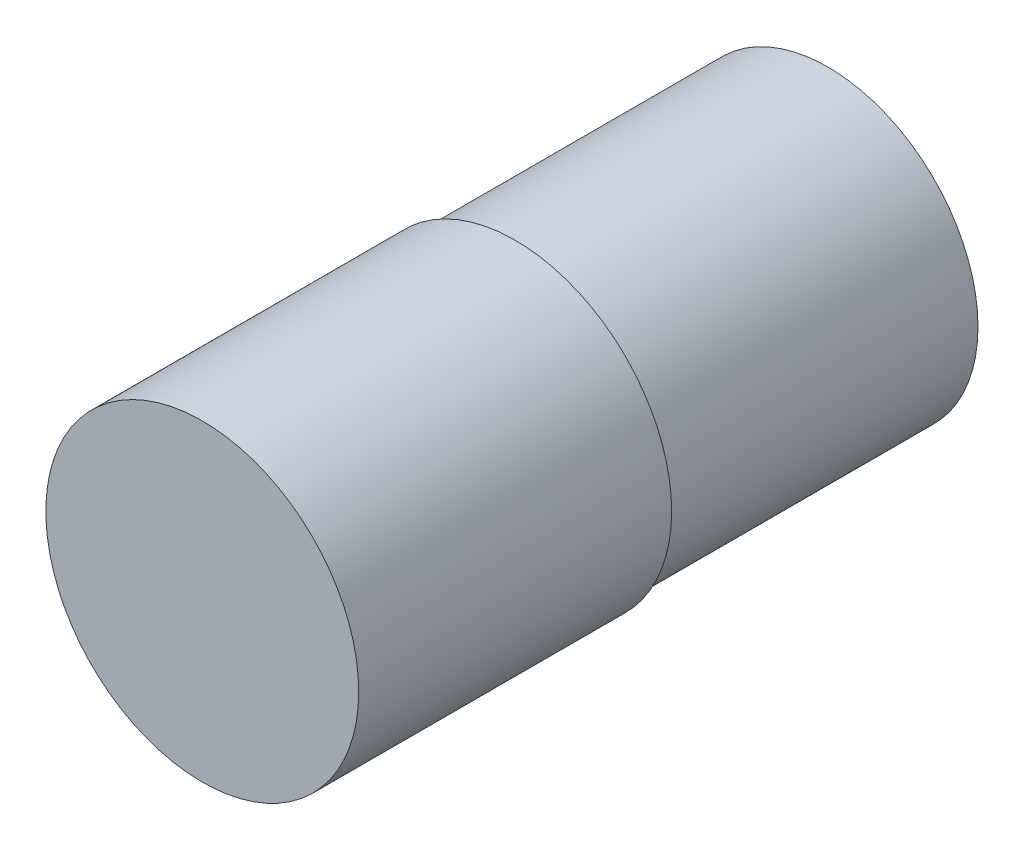
ISO-10303-21;
HEADER;
FILE_DESCRIPTION(('STEP AP214'),'2;1');
FILE_NAME('part.step','',(''),(''),'','','');
FILE_SCHEMA(('AUTOMOTIVE_DESIGN { 1 0 10303 214 1 1 1 1 }'));
ENDSEC;
DATA;
#1=APPLICATION_CONTEXT('core data for automotive mechanical design processes');
#2=APPLICATION_PROTOCOL_DEFINITION('international standard','automotive_design',2000,#1);
#3=PRODUCT_CONTEXT('',#1,'mechanical');
#4=PRODUCT('Part','Part','',(#3));
#5=PRODUCT_RELATED_PRODUCT_CATEGORY('part','',(#4));
#6=PRODUCT_DEFINITION_FORMATION('','',#4);
#7=PRODUCT_DEFINITION_CONTEXT('part definition',#1,'design');
#8=PRODUCT_DEFINITION('design','',#6,#7);
#9=PRODUCT_DEFINITION_SHAPE('','',#8);
#10=(LENGTH_UNIT() NAMED_UNIT(*) SI_UNIT(.MILLI.,.METRE.));
#11=(NAMED_UNIT(*) PLANE_ANGLE_UNIT() SI_UNIT($,.RADIAN.));
#12=(NAMED_UNIT(*) SI_UNIT($,.STERADIAN.) SOLID_ANGLE_UNIT());
#13=UNCERTAINTY_MEASURE_WITH_UNIT(LENGTH_MEASURE(1.E-05),#10,'distance_accuracy_value','');
#14=(GEOMETRIC_REPRESENTATION_CONTEXT(3) GLOBAL_UNCERTAINTY_ASSIGNED_CONTEXT((#13)) GLOBAL_UNIT_ASSIGNED_CONTEXT((#10,
#11,#12)) REPRESENTATION_CONTEXT('',''));
#15=CARTESIAN_POINT('',(0.,0.,0.));
#16=DIRECTION('',(0.,0.,1.));
#17=DIRECTION('',(1.,0.,0.));
#18=AXIS2_PLACEMENT_3D('',#15,#16,#17);
#19=CARTESIAN_POINT('',(0.,0.,4.8));
#20=DIRECTION('',(0.,0.,-1.));
#21=DIRECTION('',(-1.,0.,0.));
#22=AXIS2_PLACEMENT_3D('',#19,#20,#21);
#23=CYLINDRICAL_SURFACE('',#22,2.3);
#24=CARTESIAN_POINT('',(0.,0.,4.8));
#25=DIRECTION('',(0.,0.,1.));
#26=DIRECTION('',(1.,0.,0.));
#27=AXIS2_PLACEMENT_3D('',#24,#25,#26);
#28=CIRCLE('',#27,2.3);
#29=CARTESIAN_POINT('',(2.3,0.,4.8));
#30=VERTEX_POINT('',#29);
#31=EDGE_CURVE('E10',#30,#30,#28,.T.);
#32=ORIENTED_EDGE('',*,*,#31,.F.);
#33=EDGE_LOOP('',(#32));
#34=FACE_BOUND('',#33,.T.);
#35=CARTESIAN_POINT('',(0.,0.,0.));
#36=DIRECTION('',(0.,0.,1.));
#37=DIRECTION('',(1.,0.,0.));
#38=AXIS2_PLACEMENT_3D('',#35,#36,#37);
#39=CIRCLE('',#38,2.3);
#40=CARTESIAN_POINT('',(2.3,0.,0.));
#41=VERTEX_POINT('',#40);
#42=EDGE_CURVE('E40',#41,#41,#39,.T.);
#43=ORIENTED_EDGE('',*,*,#42,.T.);
#44=EDGE_LOOP('',(#43));
#45=FACE_BOUND('',#44,.T.);
#46=ADVANCED_FACE('F37',(#34,#45),#23,.T.);
#47=CARTESIAN_POINT('',(0.,0.,0.));
#48=DIRECTION('',(0.,0.,1.));
#49=DIRECTION('',(1.,0.,0.));
#50=AXIS2_PLACEMENT_3D('',#47,#48,#49);
#51=PLANE('',#50);
#52=ORIENTED_EDGE('',*,*,#42,.F.);
#53=EDGE_LOOP('',(#52));
#54=FACE_BOUND('',#53,.T.);
#55=ADVANCED_FACE('F64',(#54),#51,.F.);
#56=CARTESIAN_POINT('',(0.,0.,9.6));
#57=DIRECTION('',(0.,0.,-1.));
#58=DIRECTION('',(-1.,0.,0.));
#59=AXIS2_PLACEMENT_3D('',#56,#57,#58);
#60=CYLINDRICAL_SURFACE('',#59,2.4);
#61=CARTESIAN_POINT('',(0.,0.,9.6));
#62=DIRECTION('',(0.,0.,1.));
#63=DIRECTION('',(1.,0.,0.));
#64=AXIS2_PLACEMENT_3D('',#61,#62,#63);
#65=CIRCLE('',#64,2.4);
#66=CARTESIAN_POINT('',(2.4,0.,9.6));
#67=VERTEX_POINT('',#66);
#68=EDGE_CURVE('E49',#67,#67,#65,.T.);
#69=ORIENTED_EDGE('',*,*,#68,.F.);
#70=EDGE_LOOP('',(#69));
#71=FACE_BOUND('',#70,.T.);
#72=CARTESIAN_POINT('',(0.,0.,4.8));
#73=DIRECTION('',(0.,0.,1.));
#74=DIRECTION('',(1.,0.,0.));
#75=AXIS2_PLACEMENT_3D('',#72,#73,#74);
#76=CIRCLE('',#75,2.4);
#77=CARTESIAN_POINT('',(2.4,0.,4.8));
#78=VERTEX_POINT('',#77);
#79=EDGE_CURVE('E51',#78,#78,#76,.T.);
#80=ORIENTED_EDGE('',*,*,#79,.T.);
#81=EDGE_LOOP('',(#80));
#82=FACE_BOUND('',#81,.T.);
#83=ADVANCED_FACE('F61',(#71,#82),#60,.T.);
#84=CARTESIAN_POINT('',(0.,0.,9.6));
#85=DIRECTION('',(0.,0.,1.));
#86=DIRECTION('',(1.,0.,0.));
#87=AXIS2_PLACEMENT_3D('',#84,#85,#86);
#88=PLANE('',#87);
#89=ORIENTED_EDGE('',*,*,#68,.T.);
#90=EDGE_LOOP('',(#89));
#91=FACE_BOUND('',#90,.T.);
#92=ADVANCED_FACE('F59',(#91),#88,.T.);
#93=CARTESIAN_POINT('',(0.,0.,4.8));
#94=DIRECTION('',(0.,0.,1.));
#95=DIRECTION('',(1.,0.,0.));
#96=AXIS2_PLACEMENT_3D('',#93,#94,#95);
#97=PLANE('',#96);
#98=ORIENTED_EDGE('',*,*,#31,.T.);
#99=EDGE_LOOP('',(#98));
#100=FACE_BOUND('',#99,.T.);
#101=ORIENTED_EDGE('',*,*,#79,.F.);
#102=EDGE_LOOP('',(#101));
#103=FACE_BOUND('',#102,.T.);
#104=ADVANCED_FACE('F68',(#100,#103),#97,.F.);
#105=CLOSED_SHELL('',(#46,#55,#83,#92,#104));
#106=MANIFOLD_SOLID_BREP('B2',#105);
#107=ADVANCED_BREP_SHAPE_REPRESENTATION('',(#18,#106),#14);
#108=SHAPE_DEFINITION_REPRESENTATION(#9,#107);
ENDSEC;
END-ISO-10303-21;
